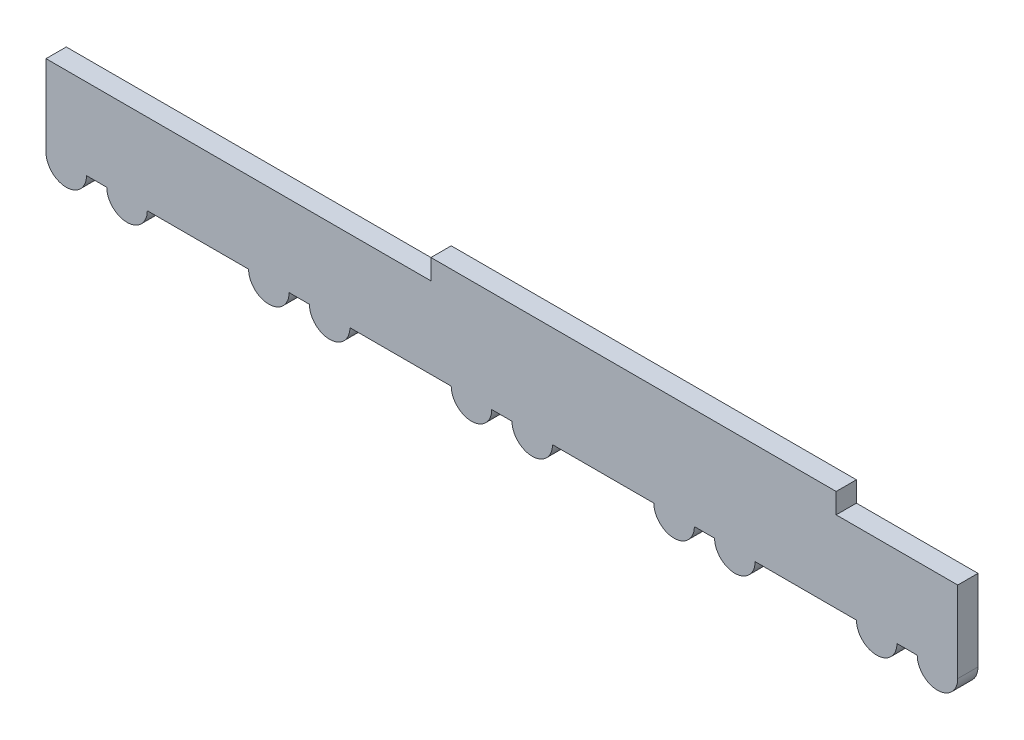
ISO-10303-21;
HEADER;
FILE_DESCRIPTION(('STEP AP214'),'2;1');
FILE_NAME('part.step','',(''),(''),'','','');
FILE_SCHEMA(('AUTOMOTIVE_DESIGN { 1 0 10303 214 1 1 1 1 }'));
ENDSEC;
DATA;
#1=APPLICATION_CONTEXT('core data for automotive mechanical design processes');
#2=APPLICATION_PROTOCOL_DEFINITION('international standard','automotive_design',2000,#1);
#3=PRODUCT_CONTEXT('',#1,'mechanical');
#4=PRODUCT('Part','Part','',(#3));
#5=PRODUCT_RELATED_PRODUCT_CATEGORY('part','',(#4));
#6=PRODUCT_DEFINITION_FORMATION('','',#4);
#7=PRODUCT_DEFINITION_CONTEXT('part definition',#1,'design');
#8=PRODUCT_DEFINITION('design','',#6,#7);
#9=PRODUCT_DEFINITION_SHAPE('','',#8);
#10=(LENGTH_UNIT() NAMED_UNIT(*) SI_UNIT(.MILLI.,.METRE.));
#11=(NAMED_UNIT(*) PLANE_ANGLE_UNIT() SI_UNIT($,.RADIAN.));
#12=(NAMED_UNIT(*) SI_UNIT($,.STERADIAN.) SOLID_ANGLE_UNIT());
#13=UNCERTAINTY_MEASURE_WITH_UNIT(LENGTH_MEASURE(1.E-05),#10,'distance_accuracy_value','');
#14=(GEOMETRIC_REPRESENTATION_CONTEXT(3) GLOBAL_UNCERTAINTY_ASSIGNED_CONTEXT((#13)) GLOBAL_UNIT_ASSIGNED_CONTEXT((#10,
#11,#12)) REPRESENTATION_CONTEXT('',''));
#15=CARTESIAN_POINT('',(0.,0.,0.));
#16=DIRECTION('',(0.,0.,1.));
#17=DIRECTION('',(1.,0.,0.));
#18=AXIS2_PLACEMENT_3D('',#15,#16,#17);
#19=CARTESIAN_POINT('',(0.,-10.0000000000001,5.));
#20=DIRECTION('',(0.,1.,0.));
#21=DIRECTION('',(-1.,0.,0.));
#22=AXIS2_PLACEMENT_3D('',#19,#20,#21);
#23=PLANE('',#22);
#24=DIRECTION('',(1.,0.,0.));
#25=VECTOR('',#24,1.);
#26=CARTESIAN_POINT('',(0.,-10.0000000000001,0.));
#27=LINE('',#26,#25);
#28=CARTESIAN_POINT('',(97.4999999999992,-9.99999999999999,0.));
#29=VERTEX_POINT('',#28);
#30=CARTESIAN_POINT('',(102.499999999999,-9.99999999999999,0.));
#31=VERTEX_POINT('',#30);
#32=EDGE_CURVE('E238',#29,#31,#27,.T.);
#33=ORIENTED_EDGE('',*,*,#32,.T.);
#34=DIRECTION('',(0.,0.,-1.));
#35=VECTOR('',#34,1.);
#36=CARTESIAN_POINT('',(102.499999999999,-9.99999999999999,5.));
#37=LINE('',#36,#35);
#38=CARTESIAN_POINT('',(102.499999999999,-9.99999999999999,5.));
#39=VERTEX_POINT('',#38);
#40=EDGE_CURVE('E11',#39,#31,#37,.T.);
#41=ORIENTED_EDGE('',*,*,#40,.F.);
#42=DIRECTION('',(1.,0.,0.));
#43=VECTOR('',#42,1.);
#44=CARTESIAN_POINT('',(0.,-10.0000000000001,5.));
#45=LINE('',#44,#43);
#46=CARTESIAN_POINT('',(97.4999999999992,-9.99999999999999,5.));
#47=VERTEX_POINT('',#46);
#48=EDGE_CURVE('E289',#47,#39,#45,.T.);
#49=ORIENTED_EDGE('',*,*,#48,.F.);
#50=DIRECTION('',(0.,0.,-1.));
#51=VECTOR('',#50,1.);
#52=CARTESIAN_POINT('',(97.4999999999992,-9.99999999999999,5.));
#53=LINE('',#52,#51);
#54=EDGE_CURVE('E234',#47,#29,#53,.T.);
#55=ORIENTED_EDGE('',*,*,#54,.T.);
#56=EDGE_LOOP('',(#33,#41,#49,#55));
#57=FACE_BOUND('',#56,.T.);
#58=ADVANCED_FACE('F34',(#57),#23,.F.);
#59=CARTESIAN_POINT('',(107.499999999999,-9.99999999999999,5.));
#60=DIRECTION('',(0.,0.,-1.));
#61=DIRECTION('',(-1.,0.,0.));
#62=AXIS2_PLACEMENT_3D('',#59,#60,#61);
#63=CYLINDRICAL_SURFACE('',#62,4.99999999999999);
#64=CARTESIAN_POINT('',(107.499999999999,-9.99999999999999,0.));
#65=DIRECTION('',(0.,0.,1.));
#66=DIRECTION('',(1.,0.,0.));
#67=AXIS2_PLACEMENT_3D('',#64,#65,#66);
#68=CIRCLE('',#67,4.99999999999999);
#69=CARTESIAN_POINT('',(112.499999999999,-10.,0.));
#70=VERTEX_POINT('',#69);
#71=EDGE_CURVE('E241',#31,#70,#68,.T.);
#72=ORIENTED_EDGE('',*,*,#71,.T.);
#73=DIRECTION('',(0.,0.,-1.));
#74=VECTOR('',#73,1.);
#75=CARTESIAN_POINT('',(112.499999999999,-10.,5.));
#76=LINE('',#75,#74);
#77=CARTESIAN_POINT('',(112.499999999999,-10.,5.));
#78=VERTEX_POINT('',#77);
#79=EDGE_CURVE('E42',#78,#70,#76,.T.);
#80=ORIENTED_EDGE('',*,*,#79,.F.);
#81=CARTESIAN_POINT('',(107.499999999999,-9.99999999999999,5.));
#82=DIRECTION('',(0.,0.,1.));
#83=DIRECTION('',(1.,0.,0.));
#84=AXIS2_PLACEMENT_3D('',#81,#82,#83);
#85=CIRCLE('',#84,4.99999999999999);
#86=EDGE_CURVE('E147',#39,#78,#85,.T.);
#87=ORIENTED_EDGE('',*,*,#86,.F.);
#88=ORIENTED_EDGE('',*,*,#40,.T.);
#89=EDGE_LOOP('',(#72,#80,#87,#88));
#90=FACE_BOUND('',#89,.T.);
#91=ADVANCED_FACE('F433',(#90),#63,.T.);
#92=CARTESIAN_POINT('',(112.499999999999,0.,5.));
#93=DIRECTION('',(-1.,0.,0.));
#94=DIRECTION('',(0.,0.,1.));
#95=AXIS2_PLACEMENT_3D('',#92,#93,#94);
#96=PLANE('',#95);
#97=DIRECTION('',(0.,1.,0.));
#98=VECTOR('',#97,1.);
#99=CARTESIAN_POINT('',(112.499999999999,0.,0.));
#100=LINE('',#99,#98);
#101=CARTESIAN_POINT('',(112.499999999999,10.,0.));
#102=VERTEX_POINT('',#101);
#103=EDGE_CURVE('E243',#70,#102,#100,.T.);
#104=ORIENTED_EDGE('',*,*,#103,.T.);
#105=DIRECTION('',(0.,0.,-1.));
#106=VECTOR('',#105,1.);
#107=CARTESIAN_POINT('',(112.499999999999,10.,5.));
#108=LINE('',#107,#106);
#109=CARTESIAN_POINT('',(112.499999999999,10.,5.));
#110=VERTEX_POINT('',#109);
#111=EDGE_CURVE('E346',#110,#102,#108,.T.);
#112=ORIENTED_EDGE('',*,*,#111,.F.);
#113=DIRECTION('',(0.,1.,0.));
#114=VECTOR('',#113,1.);
#115=CARTESIAN_POINT('',(112.499999999999,0.,5.));
#116=LINE('',#115,#114);
#117=EDGE_CURVE('E354',#78,#110,#116,.T.);
#118=ORIENTED_EDGE('',*,*,#117,.F.);
#119=ORIENTED_EDGE('',*,*,#79,.T.);
#120=EDGE_LOOP('',(#104,#112,#118,#119));
#121=FACE_BOUND('',#120,.T.);
#122=ADVANCED_FACE('F352',(#121),#96,.F.);
#123=CARTESIAN_POINT('',(0.,10.,5.));
#124=DIRECTION('',(0.,-1.,0.));
#125=DIRECTION('',(0.,0.,-1.));
#126=AXIS2_PLACEMENT_3D('',#123,#124,#125);
#127=PLANE('',#126);
#128=DIRECTION('',(-1.,0.,0.));
#129=VECTOR('',#128,1.);
#130=CARTESIAN_POINT('',(0.,10.,0.));
#131=LINE('',#130,#129);
#132=CARTESIAN_POINT('',(82.4999999999992,10.,0.));
#133=VERTEX_POINT('',#132);
#134=EDGE_CURVE('E245',#102,#133,#131,.T.);
#135=ORIENTED_EDGE('',*,*,#134,.T.);
#136=DIRECTION('',(0.,0.,-1.));
#137=VECTOR('',#136,1.);
#138=CARTESIAN_POINT('',(82.4999999999992,10.,5.));
#139=LINE('',#138,#137);
#140=CARTESIAN_POINT('',(82.4999999999992,10.,5.));
#141=VERTEX_POINT('',#140);
#142=EDGE_CURVE('E343',#141,#133,#139,.T.);
#143=ORIENTED_EDGE('',*,*,#142,.F.);
#144=DIRECTION('',(-1.,0.,0.));
#145=VECTOR('',#144,1.);
#146=CARTESIAN_POINT('',(0.,10.,5.));
#147=LINE('',#146,#145);
#148=EDGE_CURVE('E372',#110,#141,#147,.T.);
#149=ORIENTED_EDGE('',*,*,#148,.F.);
#150=ORIENTED_EDGE('',*,*,#111,.T.);
#151=EDGE_LOOP('',(#135,#143,#149,#150));
#152=FACE_BOUND('',#151,.T.);
#153=ADVANCED_FACE('F363',(#152),#127,.F.);
#154=CARTESIAN_POINT('',(82.4999999999992,0.,5.));
#155=DIRECTION('',(-1.,0.,0.));
#156=DIRECTION('',(0.,0.,1.));
#157=AXIS2_PLACEMENT_3D('',#154,#155,#156);
#158=PLANE('',#157);
#159=DIRECTION('',(0.,1.,0.));
#160=VECTOR('',#159,1.);
#161=CARTESIAN_POINT('',(82.4999999999992,0.,0.));
#162=LINE('',#161,#160);
#163=CARTESIAN_POINT('',(82.4999999999992,15.,0.));
#164=VERTEX_POINT('',#163);
#165=EDGE_CURVE('E247',#133,#164,#162,.T.);
#166=ORIENTED_EDGE('',*,*,#165,.T.);
#167=DIRECTION('',(0.,0.,-1.));
#168=VECTOR('',#167,1.);
#169=CARTESIAN_POINT('',(82.4999999999992,15.,5.));
#170=LINE('',#169,#168);
#171=CARTESIAN_POINT('',(82.4999999999992,15.,5.));
#172=VERTEX_POINT('',#171);
#173=EDGE_CURVE('E340',#172,#164,#170,.T.);
#174=ORIENTED_EDGE('',*,*,#173,.F.);
#175=DIRECTION('',(0.,1.,0.));
#176=VECTOR('',#175,1.);
#177=CARTESIAN_POINT('',(82.4999999999992,0.,5.));
#178=LINE('',#177,#176);
#179=EDGE_CURVE('E369',#141,#172,#178,.T.);
#180=ORIENTED_EDGE('',*,*,#179,.F.);
#181=ORIENTED_EDGE('',*,*,#142,.T.);
#182=EDGE_LOOP('',(#166,#174,#180,#181));
#183=FACE_BOUND('',#182,.T.);
#184=ADVANCED_FACE('F367',(#183),#158,.F.);
#185=CARTESIAN_POINT('',(0.,15.,5.));
#186=DIRECTION('',(0.,-1.,0.));
#187=DIRECTION('',(1.,0.,0.));
#188=AXIS2_PLACEMENT_3D('',#185,#186,#187);
#189=PLANE('',#188);
#190=DIRECTION('',(-1.,0.,0.));
#191=VECTOR('',#190,1.);
#192=CARTESIAN_POINT('',(0.,15.,0.));
#193=LINE('',#192,#191);
#194=CARTESIAN_POINT('',(-17.5000000000008,15.,0.));
#195=VERTEX_POINT('',#194);
#196=EDGE_CURVE('E250',#164,#195,#193,.T.);
#197=ORIENTED_EDGE('',*,*,#196,.T.);
#198=DIRECTION('',(0.,0.,-1.));
#199=VECTOR('',#198,1.);
#200=CARTESIAN_POINT('',(-17.5000000000008,15.,5.));
#201=LINE('',#200,#199);
#202=CARTESIAN_POINT('',(-17.5000000000008,15.,5.));
#203=VERTEX_POINT('',#202);
#204=EDGE_CURVE('E338',#203,#195,#201,.T.);
#205=ORIENTED_EDGE('',*,*,#204,.F.);
#206=DIRECTION('',(-1.,0.,0.));
#207=VECTOR('',#206,1.);
#208=CARTESIAN_POINT('',(0.,15.,5.));
#209=LINE('',#208,#207);
#210=EDGE_CURVE('E371',#172,#203,#209,.T.);
#211=ORIENTED_EDGE('',*,*,#210,.F.);
#212=ORIENTED_EDGE('',*,*,#173,.T.);
#213=EDGE_LOOP('',(#197,#205,#211,#212));
#214=FACE_BOUND('',#213,.T.);
#215=ADVANCED_FACE('F444',(#214),#189,.F.);
#216=CARTESIAN_POINT('',(-17.5000000000008,0.,5.));
#217=DIRECTION('',(-1.,0.,0.));
#218=DIRECTION('',(0.,0.,1.));
#219=AXIS2_PLACEMENT_3D('',#216,#217,#218);
#220=PLANE('',#219);
#221=DIRECTION('',(0.,1.,0.));
#222=VECTOR('',#221,1.);
#223=CARTESIAN_POINT('',(-17.5000000000008,0.,0.));
#224=LINE('',#223,#222);
#225=CARTESIAN_POINT('',(-17.5000000000008,10.,0.));
#226=VERTEX_POINT('',#225);
#227=EDGE_CURVE('E253',#226,#195,#224,.T.);
#228=ORIENTED_EDGE('',*,*,#227,.F.);
#229=DIRECTION('',(0.,0.,-1.));
#230=VECTOR('',#229,1.);
#231=CARTESIAN_POINT('',(-17.5000000000008,10.,5.));
#232=LINE('',#231,#230);
#233=CARTESIAN_POINT('',(-17.5000000000008,10.,5.));
#234=VERTEX_POINT('',#233);
#235=EDGE_CURVE('E336',#234,#226,#232,.T.);
#236=ORIENTED_EDGE('',*,*,#235,.F.);
#237=DIRECTION('',(0.,1.,0.));
#238=VECTOR('',#237,1.);
#239=CARTESIAN_POINT('',(-17.5000000000008,0.,5.));
#240=LINE('',#239,#238);
#241=EDGE_CURVE('E374',#234,#203,#240,.T.);
#242=ORIENTED_EDGE('',*,*,#241,.T.);
#243=ORIENTED_EDGE('',*,*,#204,.T.);
#244=EDGE_LOOP('',(#228,#236,#242,#243));
#245=FACE_BOUND('',#244,.T.);
#246=ADVANCED_FACE('F447',(#245),#220,.T.);
#247=CARTESIAN_POINT('',(-112.500000000001,10.,0.));
#248=VERTEX_POINT('',#247);
#249=EDGE_CURVE('E248',#226,#248,#131,.T.);
#250=ORIENTED_EDGE('',*,*,#249,.T.);
#251=DIRECTION('',(0.,0.,-1.));
#252=VECTOR('',#251,1.);
#253=CARTESIAN_POINT('',(-112.500000000001,10.,5.));
#254=LINE('',#253,#252);
#255=CARTESIAN_POINT('',(-112.500000000001,10.,5.));
#256=VERTEX_POINT('',#255);
#257=EDGE_CURVE('E334',#256,#248,#254,.T.);
#258=ORIENTED_EDGE('',*,*,#257,.F.);
#259=EDGE_CURVE('E377',#234,#256,#147,.T.);
#260=ORIENTED_EDGE('',*,*,#259,.F.);
#261=ORIENTED_EDGE('',*,*,#235,.T.);
#262=EDGE_LOOP('',(#250,#258,#260,#261));
#263=FACE_BOUND('',#262,.T.);
#264=ADVANCED_FACE('F451',(#263),#127,.F.);
#265=CARTESIAN_POINT('',(-112.500000000001,0.,5.));
#266=DIRECTION('',(-1.,0.,0.));
#267=DIRECTION('',(0.,0.,1.));
#268=AXIS2_PLACEMENT_3D('',#265,#266,#267);
#269=PLANE('',#268);
#270=DIRECTION('',(0.,1.,0.));
#271=VECTOR('',#270,1.);
#272=CARTESIAN_POINT('',(-112.500000000001,0.,0.));
#273=LINE('',#272,#271);
#274=CARTESIAN_POINT('',(-112.500000000001,-10.,0.));
#275=VERTEX_POINT('',#274);
#276=EDGE_CURVE('E256',#275,#248,#273,.T.);
#277=ORIENTED_EDGE('',*,*,#276,.F.);
#278=DIRECTION('',(0.,0.,-1.));
#279=VECTOR('',#278,1.);
#280=CARTESIAN_POINT('',(-112.500000000001,-10.,5.));
#281=LINE('',#280,#279);
#282=CARTESIAN_POINT('',(-112.500000000001,-10.,5.));
#283=VERTEX_POINT('',#282);
#284=EDGE_CURVE('E332',#283,#275,#281,.T.);
#285=ORIENTED_EDGE('',*,*,#284,.F.);
#286=DIRECTION('',(0.,1.,0.));
#287=VECTOR('',#286,1.);
#288=CARTESIAN_POINT('',(-112.500000000001,0.,5.));
#289=LINE('',#288,#287);
#290=EDGE_CURVE('E382',#283,#256,#289,.T.);
#291=ORIENTED_EDGE('',*,*,#290,.T.);
#292=ORIENTED_EDGE('',*,*,#257,.T.);
#293=EDGE_LOOP('',(#277,#285,#291,#292));
#294=FACE_BOUND('',#293,.T.);
#295=ADVANCED_FACE('F455',(#294),#269,.T.);
#296=CARTESIAN_POINT('',(-107.500000000001,-9.99999999999999,5.));
#297=DIRECTION('',(0.,0.,-1.));
#298=DIRECTION('',(-1.,0.,0.));
#299=AXIS2_PLACEMENT_3D('',#296,#297,#298);
#300=CYLINDRICAL_SURFACE('',#299,5.);
#301=CARTESIAN_POINT('',(-107.500000000001,-9.99999999999999,0.));
#302=DIRECTION('',(0.,0.,1.));
#303=DIRECTION('',(1.,0.,0.));
#304=AXIS2_PLACEMENT_3D('',#301,#302,#303);
#305=CIRCLE('',#304,5.);
#306=CARTESIAN_POINT('',(-102.500000000001,-9.99999999999999,0.));
#307=VERTEX_POINT('',#306);
#308=EDGE_CURVE('E259',#275,#307,#305,.T.);
#309=ORIENTED_EDGE('',*,*,#308,.T.);
#310=DIRECTION('',(0.,0.,-1.));
#311=VECTOR('',#310,1.);
#312=CARTESIAN_POINT('',(-102.500000000001,-9.99999999999999,5.));
#313=LINE('',#312,#311);
#314=CARTESIAN_POINT('',(-102.500000000001,-9.99999999999999,5.));
#315=VERTEX_POINT('',#314);
#316=EDGE_CURVE('E329',#315,#307,#313,.T.);
#317=ORIENTED_EDGE('',*,*,#316,.F.);
#318=CARTESIAN_POINT('',(-107.500000000001,-9.99999999999999,5.));
#319=DIRECTION('',(0.,0.,1.));
#320=DIRECTION('',(1.,0.,0.));
#321=AXIS2_PLACEMENT_3D('',#318,#319,#320);
#322=CIRCLE('',#321,5.);
#323=EDGE_CURVE('E385',#283,#315,#322,.T.);
#324=ORIENTED_EDGE('',*,*,#323,.F.);
#325=ORIENTED_EDGE('',*,*,#284,.T.);
#326=EDGE_LOOP('',(#309,#317,#324,#325));
#327=FACE_BOUND('',#326,.T.);
#328=ADVANCED_FACE('F459',(#327),#300,.T.);
#329=CARTESIAN_POINT('',(0.,-9.99999999999992,5.));
#330=DIRECTION('',(0.,1.,0.));
#331=DIRECTION('',(-1.,0.,0.));
#332=AXIS2_PLACEMENT_3D('',#329,#330,#331);
#333=PLANE('',#332);
#334=DIRECTION('',(1.,0.,0.));
#335=VECTOR('',#334,1.);
#336=CARTESIAN_POINT('',(0.,-9.99999999999992,0.));
#337=LINE('',#336,#335);
#338=CARTESIAN_POINT('',(-97.5000000000008,-9.99999999999999,0.));
#339=VERTEX_POINT('',#338);
#340=EDGE_CURVE('E261',#307,#339,#337,.T.);
#341=ORIENTED_EDGE('',*,*,#340,.T.);
#342=DIRECTION('',(0.,0.,-1.));
#343=VECTOR('',#342,1.);
#344=CARTESIAN_POINT('',(-97.5000000000008,-9.99999999999999,5.));
#345=LINE('',#344,#343);
#346=CARTESIAN_POINT('',(-97.5000000000008,-9.99999999999999,5.));
#347=VERTEX_POINT('',#346);
#348=EDGE_CURVE('E326',#347,#339,#345,.T.);
#349=ORIENTED_EDGE('',*,*,#348,.F.);
#350=DIRECTION('',(1.,0.,0.));
#351=VECTOR('',#350,1.);
#352=CARTESIAN_POINT('',(0.,-9.99999999999992,5.));
#353=LINE('',#352,#351);
#354=EDGE_CURVE('E387',#315,#347,#353,.T.);
#355=ORIENTED_EDGE('',*,*,#354,.F.);
#356=ORIENTED_EDGE('',*,*,#316,.T.);
#357=EDGE_LOOP('',(#341,#349,#355,#356));
#358=FACE_BOUND('',#357,.T.);
#359=ADVANCED_FACE('F463',(#358),#333,.F.);
#360=CARTESIAN_POINT('',(-92.5000000000008,-9.99999999999999,5.));
#361=DIRECTION('',(0.,0.,-1.));
#362=DIRECTION('',(-1.,0.,0.));
#363=AXIS2_PLACEMENT_3D('',#360,#361,#362);
#364=CYLINDRICAL_SURFACE('',#363,5.);
#365=CARTESIAN_POINT('',(-92.5000000000008,-9.99999999999999,0.));
#366=DIRECTION('',(0.,0.,1.));
#367=DIRECTION('',(1.,0.,0.));
#368=AXIS2_PLACEMENT_3D('',#365,#366,#367);
#369=CIRCLE('',#368,5.);
#370=CARTESIAN_POINT('',(-87.5000000000008,-9.99999999999999,0.));
#371=VERTEX_POINT('',#370);
#372=EDGE_CURVE('E263',#339,#371,#369,.T.);
#373=ORIENTED_EDGE('',*,*,#372,.T.);
#374=DIRECTION('',(0.,0.,-1.));
#375=VECTOR('',#374,1.);
#376=CARTESIAN_POINT('',(-87.5000000000008,-9.99999999999999,5.));
#377=LINE('',#376,#375);
#378=CARTESIAN_POINT('',(-87.5000000000008,-9.99999999999999,5.));
#379=VERTEX_POINT('',#378);
#380=EDGE_CURVE('E323',#379,#371,#377,.T.);
#381=ORIENTED_EDGE('',*,*,#380,.F.);
#382=CARTESIAN_POINT('',(-92.5000000000008,-9.99999999999999,5.));
#383=DIRECTION('',(0.,0.,1.));
#384=DIRECTION('',(1.,0.,0.));
#385=AXIS2_PLACEMENT_3D('',#382,#383,#384);
#386=CIRCLE('',#385,5.);
#387=EDGE_CURVE('E389',#347,#379,#386,.T.);
#388=ORIENTED_EDGE('',*,*,#387,.F.);
#389=ORIENTED_EDGE('',*,*,#348,.T.);
#390=EDGE_LOOP('',(#373,#381,#388,#389));
#391=FACE_BOUND('',#390,.T.);
#392=ADVANCED_FACE('F467',(#391),#364,.T.);
#393=CARTESIAN_POINT('',(0.,-9.99999999999998,5.));
#394=DIRECTION('',(0.,1.,0.));
#395=DIRECTION('',(-1.,0.,0.));
#396=AXIS2_PLACEMENT_3D('',#393,#394,#395);
#397=PLANE('',#396);
#398=DIRECTION('',(1.,0.,0.));
#399=VECTOR('',#398,1.);
#400=CARTESIAN_POINT('',(0.,-9.99999999999998,0.));
#401=LINE('',#400,#399);
#402=CARTESIAN_POINT('',(-62.5000000000008,-9.99999999999999,0.));
#403=VERTEX_POINT('',#402);
#404=EDGE_CURVE('E265',#371,#403,#401,.T.);
#405=ORIENTED_EDGE('',*,*,#404,.T.);
#406=DIRECTION('',(0.,0.,-1.));
#407=VECTOR('',#406,1.);
#408=CARTESIAN_POINT('',(-62.5000000000008,-9.99999999999999,5.));
#409=LINE('',#408,#407);
#410=CARTESIAN_POINT('',(-62.5000000000008,-9.99999999999999,5.));
#411=VERTEX_POINT('',#410);
#412=EDGE_CURVE('E320',#411,#403,#409,.T.);
#413=ORIENTED_EDGE('',*,*,#412,.F.);
#414=DIRECTION('',(1.,0.,0.));
#415=VECTOR('',#414,1.);
#416=CARTESIAN_POINT('',(0.,-9.99999999999998,5.));
#417=LINE('',#416,#415);
#418=EDGE_CURVE('E391',#379,#411,#417,.T.);
#419=ORIENTED_EDGE('',*,*,#418,.F.);
#420=ORIENTED_EDGE('',*,*,#380,.T.);
#421=EDGE_LOOP('',(#405,#413,#419,#420));
#422=FACE_BOUND('',#421,.T.);
#423=ADVANCED_FACE('F471',(#422),#397,.F.);
#424=CARTESIAN_POINT('',(-57.5000000000008,-9.99999999999999,5.));
#425=DIRECTION('',(0.,0.,-1.));
#426=DIRECTION('',(-1.,0.,0.));
#427=AXIS2_PLACEMENT_3D('',#424,#425,#426);
#428=CYLINDRICAL_SURFACE('',#427,5.);
#429=CARTESIAN_POINT('',(-57.5000000000008,-9.99999999999999,0.));
#430=DIRECTION('',(0.,0.,1.));
#431=DIRECTION('',(1.,0.,0.));
#432=AXIS2_PLACEMENT_3D('',#429,#430,#431);
#433=CIRCLE('',#432,5.);
#434=CARTESIAN_POINT('',(-52.5000000000008,-9.99999999999999,0.));
#435=VERTEX_POINT('',#434);
#436=EDGE_CURVE('E267',#403,#435,#433,.T.);
#437=ORIENTED_EDGE('',*,*,#436,.T.);
#438=DIRECTION('',(0.,0.,-1.));
#439=VECTOR('',#438,1.);
#440=CARTESIAN_POINT('',(-52.5000000000008,-9.99999999999999,5.));
#441=LINE('',#440,#439);
#442=CARTESIAN_POINT('',(-52.5000000000008,-9.99999999999999,5.));
#443=VERTEX_POINT('',#442);
#444=EDGE_CURVE('E317',#443,#435,#441,.T.);
#445=ORIENTED_EDGE('',*,*,#444,.F.);
#446=CARTESIAN_POINT('',(-57.5000000000008,-9.99999999999999,5.));
#447=DIRECTION('',(0.,0.,1.));
#448=DIRECTION('',(1.,0.,0.));
#449=AXIS2_PLACEMENT_3D('',#446,#447,#448);
#450=CIRCLE('',#449,5.);
#451=EDGE_CURVE('E393',#411,#443,#450,.T.);
#452=ORIENTED_EDGE('',*,*,#451,.F.);
#453=ORIENTED_EDGE('',*,*,#412,.T.);
#454=EDGE_LOOP('',(#437,#445,#452,#453));
#455=FACE_BOUND('',#454,.T.);
#456=ADVANCED_FACE('F473',(#455),#428,.T.);
#457=CARTESIAN_POINT('',(-47.5000000000008,-9.99999999999999,0.));
#458=VERTEX_POINT('',#457);
#459=EDGE_CURVE('E268',#435,#458,#401,.T.);
#460=ORIENTED_EDGE('',*,*,#459,.T.);
#461=DIRECTION('',(0.,0.,-1.));
#462=VECTOR('',#461,1.);
#463=CARTESIAN_POINT('',(-47.5000000000008,-9.99999999999999,5.));
#464=LINE('',#463,#462);
#465=CARTESIAN_POINT('',(-47.5000000000008,-9.99999999999999,5.));
#466=VERTEX_POINT('',#465);
#467=EDGE_CURVE('E314',#466,#458,#464,.T.);
#468=ORIENTED_EDGE('',*,*,#467,.F.);
#469=EDGE_CURVE('E394',#443,#466,#417,.T.);
#470=ORIENTED_EDGE('',*,*,#469,.F.);
#471=ORIENTED_EDGE('',*,*,#444,.T.);
#472=EDGE_LOOP('',(#460,#468,#470,#471));
#473=FACE_BOUND('',#472,.T.);
#474=ADVANCED_FACE('F476',(#473),#397,.F.);
#475=CARTESIAN_POINT('',(-42.5000000000008,-9.99999999999999,5.));
#476=DIRECTION('',(0.,0.,-1.));
#477=DIRECTION('',(-1.,0.,0.));
#478=AXIS2_PLACEMENT_3D('',#475,#476,#477);
#479=CYLINDRICAL_SURFACE('',#478,5.);
#480=CARTESIAN_POINT('',(-42.5000000000008,-9.99999999999999,0.));
#481=DIRECTION('',(0.,0.,1.));
#482=DIRECTION('',(1.,0.,0.));
#483=AXIS2_PLACEMENT_3D('',#480,#481,#482);
#484=CIRCLE('',#483,5.);
#485=CARTESIAN_POINT('',(-37.5000000000008,-9.99999999999999,0.));
#486=VERTEX_POINT('',#485);
#487=EDGE_CURVE('E270',#458,#486,#484,.T.);
#488=ORIENTED_EDGE('',*,*,#487,.T.);
#489=DIRECTION('',(0.,0.,-1.));
#490=VECTOR('',#489,1.);
#491=CARTESIAN_POINT('',(-37.5000000000008,-9.99999999999999,5.));
#492=LINE('',#491,#490);
#493=CARTESIAN_POINT('',(-37.5000000000008,-9.99999999999999,5.));
#494=VERTEX_POINT('',#493);
#495=EDGE_CURVE('E311',#494,#486,#492,.T.);
#496=ORIENTED_EDGE('',*,*,#495,.F.);
#497=CARTESIAN_POINT('',(-42.5000000000008,-9.99999999999999,5.));
#498=DIRECTION('',(0.,0.,1.));
#499=DIRECTION('',(1.,0.,0.));
#500=AXIS2_PLACEMENT_3D('',#497,#498,#499);
#501=CIRCLE('',#500,5.);
#502=EDGE_CURVE('E396',#466,#494,#501,.T.);
#503=ORIENTED_EDGE('',*,*,#502,.F.);
#504=ORIENTED_EDGE('',*,*,#467,.T.);
#505=EDGE_LOOP('',(#488,#496,#503,#504));
#506=FACE_BOUND('',#505,.T.);
#507=ADVANCED_FACE('F480',(#506),#479,.T.);
#508=CARTESIAN_POINT('',(0.,-10.,5.));
#509=DIRECTION('',(0.,1.,0.));
#510=DIRECTION('',(-1.,0.,0.));
#511=AXIS2_PLACEMENT_3D('',#508,#509,#510);
#512=PLANE('',#511);
#513=DIRECTION('',(1.,0.,0.));
#514=VECTOR('',#513,1.);
#515=CARTESIAN_POINT('',(0.,-10.,0.));
#516=LINE('',#515,#514);
#517=CARTESIAN_POINT('',(-12.5000000000008,-10.,0.));
#518=VERTEX_POINT('',#517);
#519=EDGE_CURVE('E272',#486,#518,#516,.T.);
#520=ORIENTED_EDGE('',*,*,#519,.T.);
#521=DIRECTION('',(0.,0.,-1.));
#522=VECTOR('',#521,1.);
#523=CARTESIAN_POINT('',(-12.5000000000008,-10.,5.));
#524=LINE('',#523,#522);
#525=CARTESIAN_POINT('',(-12.5000000000008,-10.,5.));
#526=VERTEX_POINT('',#525);
#527=EDGE_CURVE('E308',#526,#518,#524,.T.);
#528=ORIENTED_EDGE('',*,*,#527,.F.);
#529=DIRECTION('',(1.,0.,0.));
#530=VECTOR('',#529,1.);
#531=CARTESIAN_POINT('',(0.,-10.,5.));
#532=LINE('',#531,#530);
#533=EDGE_CURVE('E398',#494,#526,#532,.T.);
#534=ORIENTED_EDGE('',*,*,#533,.F.);
#535=ORIENTED_EDGE('',*,*,#495,.T.);
#536=EDGE_LOOP('',(#520,#528,#534,#535));
#537=FACE_BOUND('',#536,.T.);
#538=ADVANCED_FACE('F484',(#537),#512,.F.);
#539=CARTESIAN_POINT('',(-7.50000000000077,-9.99999999999999,5.));
#540=DIRECTION('',(0.,0.,-1.));
#541=DIRECTION('',(-1.,0.,0.));
#542=AXIS2_PLACEMENT_3D('',#539,#540,#541);
#543=CYLINDRICAL_SURFACE('',#542,5.);
#544=CARTESIAN_POINT('',(-7.50000000000077,-9.99999999999999,0.));
#545=DIRECTION('',(0.,0.,1.));
#546=DIRECTION('',(1.,0.,0.));
#547=AXIS2_PLACEMENT_3D('',#544,#545,#546);
#548=CIRCLE('',#547,5.);
#549=CARTESIAN_POINT('',(-2.50000000000077,-9.99999999999999,0.));
#550=VERTEX_POINT('',#549);
#551=EDGE_CURVE('E274',#518,#550,#548,.T.);
#552=ORIENTED_EDGE('',*,*,#551,.T.);
#553=DIRECTION('',(0.,0.,-1.));
#554=VECTOR('',#553,1.);
#555=CARTESIAN_POINT('',(-2.50000000000077,-9.99999999999999,5.));
#556=LINE('',#555,#554);
#557=CARTESIAN_POINT('',(-2.50000000000077,-9.99999999999999,5.));
#558=VERTEX_POINT('',#557);
#559=EDGE_CURVE('E305',#558,#550,#556,.T.);
#560=ORIENTED_EDGE('',*,*,#559,.F.);
#561=CARTESIAN_POINT('',(-7.50000000000077,-9.99999999999999,5.));
#562=DIRECTION('',(0.,0.,1.));
#563=DIRECTION('',(1.,0.,0.));
#564=AXIS2_PLACEMENT_3D('',#561,#562,#563);
#565=CIRCLE('',#564,5.);
#566=EDGE_CURVE('E400',#526,#558,#565,.T.);
#567=ORIENTED_EDGE('',*,*,#566,.F.);
#568=ORIENTED_EDGE('',*,*,#527,.T.);
#569=EDGE_LOOP('',(#552,#560,#567,#568));
#570=FACE_BOUND('',#569,.T.);
#571=ADVANCED_FACE('F488',(#570),#543,.T.);
#572=CARTESIAN_POINT('',(0.,-9.99999999999999,5.));
#573=DIRECTION('',(0.,1.,0.));
#574=DIRECTION('',(-1.,0.,0.));
#575=AXIS2_PLACEMENT_3D('',#572,#573,#574);
#576=PLANE('',#575);
#577=DIRECTION('',(1.,0.,0.));
#578=VECTOR('',#577,1.);
#579=CARTESIAN_POINT('',(0.,-9.99999999999999,0.));
#580=LINE('',#579,#578);
#581=CARTESIAN_POINT('',(2.49999999999924,-9.99999999999999,0.));
#582=VERTEX_POINT('',#581);
#583=EDGE_CURVE('E276',#550,#582,#580,.T.);
#584=ORIENTED_EDGE('',*,*,#583,.T.);
#585=DIRECTION('',(0.,0.,-1.));
#586=VECTOR('',#585,1.);
#587=CARTESIAN_POINT('',(2.49999999999924,-9.99999999999999,5.));
#588=LINE('',#587,#586);
#589=CARTESIAN_POINT('',(2.49999999999924,-9.99999999999999,5.));
#590=VERTEX_POINT('',#589);
#591=EDGE_CURVE('E302',#590,#582,#588,.T.);
#592=ORIENTED_EDGE('',*,*,#591,.F.);
#593=DIRECTION('',(1.,0.,0.));
#594=VECTOR('',#593,1.);
#595=CARTESIAN_POINT('',(0.,-9.99999999999999,5.));
#596=LINE('',#595,#594);
#597=EDGE_CURVE('E402',#558,#590,#596,.T.);
#598=ORIENTED_EDGE('',*,*,#597,.F.);
#599=ORIENTED_EDGE('',*,*,#559,.T.);
#600=EDGE_LOOP('',(#584,#592,#598,#599));
#601=FACE_BOUND('',#600,.T.);
#602=ADVANCED_FACE('F492',(#601),#576,.F.);
#603=CARTESIAN_POINT('',(7.49999999999924,-9.99999999999999,5.));
#604=DIRECTION('',(0.,0.,-1.));
#605=DIRECTION('',(-1.,0.,0.));
#606=AXIS2_PLACEMENT_3D('',#603,#604,#605);
#607=CYLINDRICAL_SURFACE('',#606,5.);
#608=CARTESIAN_POINT('',(7.49999999999924,-9.99999999999999,0.));
#609=DIRECTION('',(0.,0.,1.));
#610=DIRECTION('',(1.,0.,0.));
#611=AXIS2_PLACEMENT_3D('',#608,#609,#610);
#612=CIRCLE('',#611,5.);
#613=CARTESIAN_POINT('',(12.4999999999992,-9.99999999999999,0.));
#614=VERTEX_POINT('',#613);
#615=EDGE_CURVE('E278',#582,#614,#612,.T.);
#616=ORIENTED_EDGE('',*,*,#615,.T.);
#617=DIRECTION('',(0.,0.,-1.));
#618=VECTOR('',#617,1.);
#619=CARTESIAN_POINT('',(12.4999999999992,-9.99999999999999,5.));
#620=LINE('',#619,#618);
#621=CARTESIAN_POINT('',(12.4999999999992,-9.99999999999999,5.));
#622=VERTEX_POINT('',#621);
#623=EDGE_CURVE('E299',#622,#614,#620,.T.);
#624=ORIENTED_EDGE('',*,*,#623,.F.);
#625=CARTESIAN_POINT('',(7.49999999999924,-9.99999999999999,5.));
#626=DIRECTION('',(0.,0.,1.));
#627=DIRECTION('',(1.,0.,0.));
#628=AXIS2_PLACEMENT_3D('',#625,#626,#627);
#629=CIRCLE('',#628,5.);
#630=EDGE_CURVE('E404',#590,#622,#629,.T.);
#631=ORIENTED_EDGE('',*,*,#630,.F.);
#632=ORIENTED_EDGE('',*,*,#591,.T.);
#633=EDGE_LOOP('',(#616,#624,#631,#632));
#634=FACE_BOUND('',#633,.T.);
#635=ADVANCED_FACE('F496',(#634),#607,.T.);
#636=CARTESIAN_POINT('',(0.,-9.99999999999998,5.));
#637=DIRECTION('',(0.,1.,0.));
#638=DIRECTION('',(-1.,0.,0.));
#639=AXIS2_PLACEMENT_3D('',#636,#637,#638);
#640=PLANE('',#639);
#641=DIRECTION('',(1.,0.,0.));
#642=VECTOR('',#641,1.);
#643=CARTESIAN_POINT('',(0.,-9.99999999999998,0.));
#644=LINE('',#643,#642);
#645=CARTESIAN_POINT('',(37.4999999999992,-10.,0.));
#646=VERTEX_POINT('',#645);
#647=EDGE_CURVE('E280',#614,#646,#644,.T.);
#648=ORIENTED_EDGE('',*,*,#647,.T.);
#649=DIRECTION('',(0.,0.,-1.));
#650=VECTOR('',#649,1.);
#651=CARTESIAN_POINT('',(37.4999999999992,-10.,5.));
#652=LINE('',#651,#650);
#653=CARTESIAN_POINT('',(37.4999999999992,-10.,5.));
#654=VERTEX_POINT('',#653);
#655=EDGE_CURVE('E296',#654,#646,#652,.T.);
#656=ORIENTED_EDGE('',*,*,#655,.F.);
#657=DIRECTION('',(1.,0.,0.));
#658=VECTOR('',#657,1.);
#659=CARTESIAN_POINT('',(0.,-9.99999999999998,5.));
#660=LINE('',#659,#658);
#661=EDGE_CURVE('E406',#622,#654,#660,.T.);
#662=ORIENTED_EDGE('',*,*,#661,.F.);
#663=ORIENTED_EDGE('',*,*,#623,.T.);
#664=EDGE_LOOP('',(#648,#656,#662,#663));
#665=FACE_BOUND('',#664,.T.);
#666=ADVANCED_FACE('F500',(#665),#640,.F.);
#667=CARTESIAN_POINT('',(42.4999999999992,-9.99999999999999,5.));
#668=DIRECTION('',(0.,0.,-1.));
#669=DIRECTION('',(-1.,0.,0.));
#670=AXIS2_PLACEMENT_3D('',#667,#668,#669);
#671=CYLINDRICAL_SURFACE('',#670,5.);
#672=CARTESIAN_POINT('',(42.4999999999992,-9.99999999999999,0.));
#673=DIRECTION('',(0.,0.,1.));
#674=DIRECTION('',(1.,0.,0.));
#675=AXIS2_PLACEMENT_3D('',#672,#673,#674);
#676=CIRCLE('',#675,5.);
#677=CARTESIAN_POINT('',(47.4999999999993,-9.99999999999999,0.));
#678=VERTEX_POINT('',#677);
#679=EDGE_CURVE('E282',#646,#678,#676,.T.);
#680=ORIENTED_EDGE('',*,*,#679,.T.);
#681=DIRECTION('',(0.,0.,-1.));
#682=VECTOR('',#681,1.);
#683=CARTESIAN_POINT('',(47.4999999999993,-9.99999999999999,5.));
#684=LINE('',#683,#682);
#685=CARTESIAN_POINT('',(47.4999999999993,-9.99999999999999,5.));
#686=VERTEX_POINT('',#685);
#687=EDGE_CURVE('E293',#686,#678,#684,.T.);
#688=ORIENTED_EDGE('',*,*,#687,.F.);
#689=CARTESIAN_POINT('',(42.4999999999992,-9.99999999999999,5.));
#690=DIRECTION('',(0.,0.,1.));
#691=DIRECTION('',(1.,0.,0.));
#692=AXIS2_PLACEMENT_3D('',#689,#690,#691);
#693=CIRCLE('',#692,5.);
#694=EDGE_CURVE('E408',#654,#686,#693,.T.);
#695=ORIENTED_EDGE('',*,*,#694,.F.);
#696=ORIENTED_EDGE('',*,*,#655,.T.);
#697=EDGE_LOOP('',(#680,#688,#695,#696));
#698=FACE_BOUND('',#697,.T.);
#699=ADVANCED_FACE('F414',(#698),#671,.T.);
#700=CARTESIAN_POINT('',(0.,-10.,5.));
#701=DIRECTION('',(0.,1.,0.));
#702=DIRECTION('',(-1.,0.,0.));
#703=AXIS2_PLACEMENT_3D('',#700,#701,#702);
#704=PLANE('',#703);
#705=DIRECTION('',(1.,0.,0.));
#706=VECTOR('',#705,1.);
#707=CARTESIAN_POINT('',(0.,-10.,0.));
#708=LINE('',#707,#706);
#709=CARTESIAN_POINT('',(52.4999999999993,-9.99999999999999,0.));
#710=VERTEX_POINT('',#709);
#711=EDGE_CURVE('E284',#678,#710,#708,.T.);
#712=ORIENTED_EDGE('',*,*,#711,.T.);
#713=DIRECTION('',(0.,0.,-1.));
#714=VECTOR('',#713,1.);
#715=CARTESIAN_POINT('',(52.4999999999993,-9.99999999999999,5.));
#716=LINE('',#715,#714);
#717=CARTESIAN_POINT('',(52.4999999999993,-9.99999999999999,5.));
#718=VERTEX_POINT('',#717);
#719=EDGE_CURVE('E229',#718,#710,#716,.T.);
#720=ORIENTED_EDGE('',*,*,#719,.F.);
#721=DIRECTION('',(1.,0.,0.));
#722=VECTOR('',#721,1.);
#723=CARTESIAN_POINT('',(0.,-10.,5.));
#724=LINE('',#723,#722);
#725=EDGE_CURVE('E220',#686,#718,#724,.T.);
#726=ORIENTED_EDGE('',*,*,#725,.F.);
#727=ORIENTED_EDGE('',*,*,#687,.T.);
#728=EDGE_LOOP('',(#712,#720,#726,#727));
#729=FACE_BOUND('',#728,.T.);
#730=ADVANCED_FACE('F418',(#729),#704,.F.);
#731=CARTESIAN_POINT('',(57.4999999999993,-9.99999999999999,5.));
#732=DIRECTION('',(0.,0.,-1.));
#733=DIRECTION('',(-1.,0.,0.));
#734=AXIS2_PLACEMENT_3D('',#731,#732,#733);
#735=CYLINDRICAL_SURFACE('',#734,5.);
#736=CARTESIAN_POINT('',(57.4999999999993,-9.99999999999999,0.));
#737=DIRECTION('',(0.,0.,1.));
#738=DIRECTION('',(1.,0.,0.));
#739=AXIS2_PLACEMENT_3D('',#736,#737,#738);
#740=CIRCLE('',#739,5.);
#741=CARTESIAN_POINT('',(62.4999999999993,-9.99999999999999,0.));
#742=VERTEX_POINT('',#741);
#743=EDGE_CURVE('E228',#710,#742,#740,.T.);
#744=ORIENTED_EDGE('',*,*,#743,.T.);
#745=DIRECTION('',(0.,0.,-1.));
#746=VECTOR('',#745,1.);
#747=CARTESIAN_POINT('',(62.4999999999993,-9.99999999999999,5.));
#748=LINE('',#747,#746);
#749=CARTESIAN_POINT('',(62.4999999999993,-9.99999999999999,5.));
#750=VERTEX_POINT('',#749);
#751=EDGE_CURVE('E225',#750,#742,#748,.T.);
#752=ORIENTED_EDGE('',*,*,#751,.F.);
#753=CARTESIAN_POINT('',(57.4999999999993,-9.99999999999999,5.));
#754=DIRECTION('',(0.,0.,1.));
#755=DIRECTION('',(1.,0.,0.));
#756=AXIS2_PLACEMENT_3D('',#753,#754,#755);
#757=CIRCLE('',#756,5.);
#758=EDGE_CURVE('E214',#718,#750,#757,.T.);
#759=ORIENTED_EDGE('',*,*,#758,.F.);
#760=ORIENTED_EDGE('',*,*,#719,.T.);
#761=EDGE_LOOP('',(#744,#752,#759,#760));
#762=FACE_BOUND('',#761,.T.);
#763=ADVANCED_FACE('F226',(#762),#735,.T.);
#764=CARTESIAN_POINT('',(0.,-9.99999999999994,5.));
#765=DIRECTION('',(0.,1.,0.));
#766=DIRECTION('',(-1.,0.,0.));
#767=AXIS2_PLACEMENT_3D('',#764,#765,#766);
#768=PLANE('',#767);
#769=DIRECTION('',(1.,0.,0.));
#770=VECTOR('',#769,1.);
#771=CARTESIAN_POINT('',(0.,-9.99999999999994,0.));
#772=LINE('',#771,#770);
#773=CARTESIAN_POINT('',(87.4999999999992,-10.,0.));
#774=VERTEX_POINT('',#773);
#775=EDGE_CURVE('E133',#742,#774,#772,.T.);
#776=ORIENTED_EDGE('',*,*,#775,.T.);
#777=DIRECTION('',(0.,0.,-1.));
#778=VECTOR('',#777,1.);
#779=CARTESIAN_POINT('',(87.4999999999992,-10.,5.));
#780=LINE('',#779,#778);
#781=CARTESIAN_POINT('',(87.4999999999992,-10.,5.));
#782=VERTEX_POINT('',#781);
#783=EDGE_CURVE('E230',#782,#774,#780,.T.);
#784=ORIENTED_EDGE('',*,*,#783,.F.);
#785=DIRECTION('',(1.,0.,0.));
#786=VECTOR('',#785,1.);
#787=CARTESIAN_POINT('',(0.,-9.99999999999994,5.));
#788=LINE('',#787,#786);
#789=EDGE_CURVE('E218',#750,#782,#788,.T.);
#790=ORIENTED_EDGE('',*,*,#789,.F.);
#791=ORIENTED_EDGE('',*,*,#751,.T.);
#792=EDGE_LOOP('',(#776,#784,#790,#791));
#793=FACE_BOUND('',#792,.T.);
#794=ADVANCED_FACE('F232',(#793),#768,.F.);
#795=CARTESIAN_POINT('',(92.4999999999992,-9.99999999999999,5.));
#796=DIRECTION('',(0.,0.,-1.));
#797=DIRECTION('',(-1.,0.,0.));
#798=AXIS2_PLACEMENT_3D('',#795,#796,#797);
#799=CYLINDRICAL_SURFACE('',#798,5.);
#800=CARTESIAN_POINT('',(92.4999999999992,-9.99999999999999,0.));
#801=DIRECTION('',(0.,0.,1.));
#802=DIRECTION('',(1.,0.,0.));
#803=AXIS2_PLACEMENT_3D('',#800,#801,#802);
#804=CIRCLE('',#803,5.);
#805=EDGE_CURVE('E139',#774,#29,#804,.T.);
#806=ORIENTED_EDGE('',*,*,#805,.T.);
#807=ORIENTED_EDGE('',*,*,#54,.F.);
#808=CARTESIAN_POINT('',(92.4999999999992,-9.99999999999999,5.));
#809=DIRECTION('',(0.,0.,1.));
#810=DIRECTION('',(1.,0.,0.));
#811=AXIS2_PLACEMENT_3D('',#808,#809,#810);
#812=CIRCLE('',#811,5.);
#813=EDGE_CURVE('E50',#782,#47,#812,.T.);
#814=ORIENTED_EDGE('',*,*,#813,.F.);
#815=ORIENTED_EDGE('',*,*,#783,.T.);
#816=EDGE_LOOP('',(#806,#807,#814,#815));
#817=FACE_BOUND('',#816,.T.);
#818=ADVANCED_FACE('F422',(#817),#799,.T.);
#819=CARTESIAN_POINT('',(0.,0.,5.));
#820=DIRECTION('',(0.,0.,1.));
#821=DIRECTION('',(1.,0.,0.));
#822=AXIS2_PLACEMENT_3D('',#819,#820,#821);
#823=PLANE('',#822);
#824=ORIENTED_EDGE('',*,*,#48,.T.);
#825=ORIENTED_EDGE('',*,*,#86,.T.);
#826=ORIENTED_EDGE('',*,*,#117,.T.);
#827=ORIENTED_EDGE('',*,*,#148,.T.);
#828=ORIENTED_EDGE('',*,*,#179,.T.);
#829=ORIENTED_EDGE('',*,*,#210,.T.);
#830=ORIENTED_EDGE('',*,*,#241,.F.);
#831=ORIENTED_EDGE('',*,*,#259,.T.);
#832=ORIENTED_EDGE('',*,*,#290,.F.);
#833=ORIENTED_EDGE('',*,*,#323,.T.);
#834=ORIENTED_EDGE('',*,*,#354,.T.);
#835=ORIENTED_EDGE('',*,*,#387,.T.);
#836=ORIENTED_EDGE('',*,*,#418,.T.);
#837=ORIENTED_EDGE('',*,*,#451,.T.);
#838=ORIENTED_EDGE('',*,*,#469,.T.);
#839=ORIENTED_EDGE('',*,*,#502,.T.);
#840=ORIENTED_EDGE('',*,*,#533,.T.);
#841=ORIENTED_EDGE('',*,*,#566,.T.);
#842=ORIENTED_EDGE('',*,*,#597,.T.);
#843=ORIENTED_EDGE('',*,*,#630,.T.);
#844=ORIENTED_EDGE('',*,*,#661,.T.);
#845=ORIENTED_EDGE('',*,*,#694,.T.);
#846=ORIENTED_EDGE('',*,*,#725,.T.);
#847=ORIENTED_EDGE('',*,*,#758,.T.);
#848=ORIENTED_EDGE('',*,*,#789,.T.);
#849=ORIENTED_EDGE('',*,*,#813,.T.);
#850=EDGE_LOOP('',(#824,#825,#826,#827,#828,#829,#830,#831,#832,#833,#834,#835,#836,#837,#838,
#839,#840,#841,#842,#843,#844,#845,#846,#847,#848,#849));
#851=FACE_BOUND('',#850,.T.);
#852=ADVANCED_FACE('F216',(#851),#823,.T.);
#853=CARTESIAN_POINT('',(0.,0.,0.));
#854=DIRECTION('',(0.,0.,1.));
#855=DIRECTION('',(1.,0.,0.));
#856=AXIS2_PLACEMENT_3D('',#853,#854,#855);
#857=PLANE('',#856);
#858=ORIENTED_EDGE('',*,*,#32,.F.);
#859=ORIENTED_EDGE('',*,*,#805,.F.);
#860=ORIENTED_EDGE('',*,*,#775,.F.);
#861=ORIENTED_EDGE('',*,*,#743,.F.);
#862=ORIENTED_EDGE('',*,*,#711,.F.);
#863=ORIENTED_EDGE('',*,*,#679,.F.);
#864=ORIENTED_EDGE('',*,*,#647,.F.);
#865=ORIENTED_EDGE('',*,*,#615,.F.);
#866=ORIENTED_EDGE('',*,*,#583,.F.);
#867=ORIENTED_EDGE('',*,*,#551,.F.);
#868=ORIENTED_EDGE('',*,*,#519,.F.);
#869=ORIENTED_EDGE('',*,*,#487,.F.);
#870=ORIENTED_EDGE('',*,*,#459,.F.);
#871=ORIENTED_EDGE('',*,*,#436,.F.);
#872=ORIENTED_EDGE('',*,*,#404,.F.);
#873=ORIENTED_EDGE('',*,*,#372,.F.);
#874=ORIENTED_EDGE('',*,*,#340,.F.);
#875=ORIENTED_EDGE('',*,*,#308,.F.);
#876=ORIENTED_EDGE('',*,*,#276,.T.);
#877=ORIENTED_EDGE('',*,*,#249,.F.);
#878=ORIENTED_EDGE('',*,*,#227,.T.);
#879=ORIENTED_EDGE('',*,*,#196,.F.);
#880=ORIENTED_EDGE('',*,*,#165,.F.);
#881=ORIENTED_EDGE('',*,*,#134,.F.);
#882=ORIENTED_EDGE('',*,*,#103,.F.);
#883=ORIENTED_EDGE('',*,*,#71,.F.);
#884=EDGE_LOOP('',(#858,#859,#860,#861,#862,#863,#864,#865,#866,#867,#868,#869,#870,#871,#872,
#873,#874,#875,#876,#877,#878,#879,#880,#881,#882,#883));
#885=FACE_BOUND('',#884,.T.);
#886=ADVANCED_FACE('F358',(#885),#857,.F.);
#887=CLOSED_SHELL('',(#58,#91,#122,#153,#184,#215,#246,#264,#295,#328,#359,#392,#423,#456,#474,
#507,#538,#571,#602,#635,#666,#699,#730,#763,#794,#818,#852,#886));
#888=MANIFOLD_SOLID_BREP('B2',#887);
#889=ADVANCED_BREP_SHAPE_REPRESENTATION('',(#18,#888),#14);
#890=SHAPE_DEFINITION_REPRESENTATION(#9,#889);
ENDSEC;
END-ISO-10303-21;
